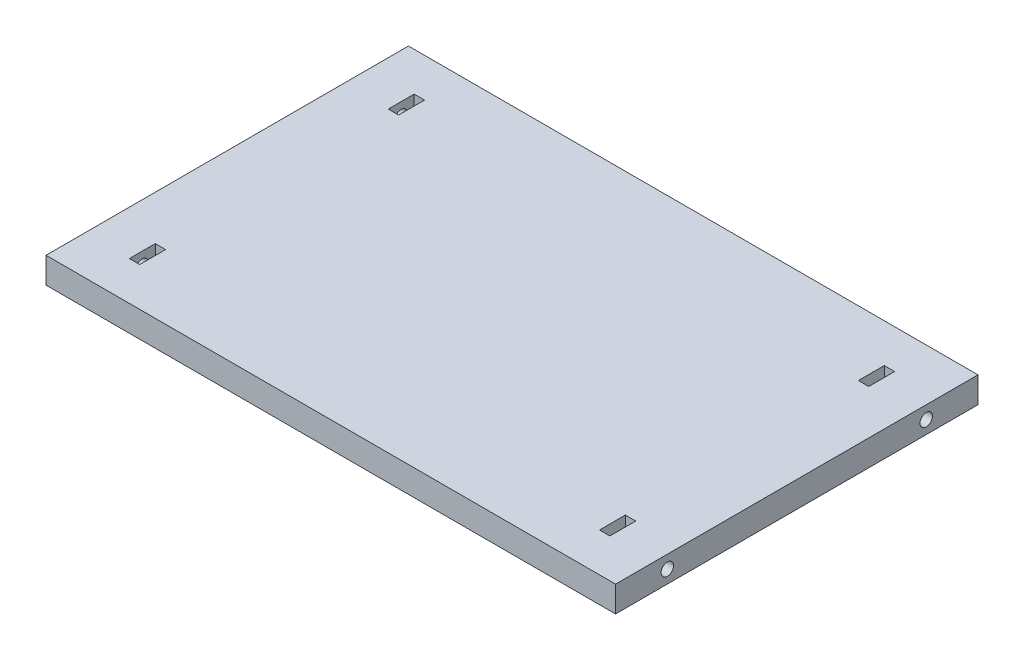
ISO-10303-21;
HEADER;
FILE_DESCRIPTION(('STEP AP214'),'2;1');
FILE_NAME('part.step','',(''),(''),'','','');
FILE_SCHEMA(('AUTOMOTIVE_DESIGN { 1 0 10303 214 1 1 1 1 }'));
ENDSEC;
DATA;
#1=APPLICATION_CONTEXT('core data for automotive mechanical design processes');
#2=APPLICATION_PROTOCOL_DEFINITION('international standard','automotive_design',2000,#1);
#3=PRODUCT_CONTEXT('',#1,'mechanical');
#4=PRODUCT('Part','Part','',(#3));
#5=PRODUCT_RELATED_PRODUCT_CATEGORY('part','',(#4));
#6=PRODUCT_DEFINITION_FORMATION('','',#4);
#7=PRODUCT_DEFINITION_CONTEXT('part definition',#1,'design');
#8=PRODUCT_DEFINITION('design','',#6,#7);
#9=PRODUCT_DEFINITION_SHAPE('','',#8);
#10=(LENGTH_UNIT() NAMED_UNIT(*) SI_UNIT(.MILLI.,.METRE.));
#11=(NAMED_UNIT(*) PLANE_ANGLE_UNIT() SI_UNIT($,.RADIAN.));
#12=(NAMED_UNIT(*) SI_UNIT($,.STERADIAN.) SOLID_ANGLE_UNIT());
#13=UNCERTAINTY_MEASURE_WITH_UNIT(LENGTH_MEASURE(1.E-05),#10,'distance_accuracy_value','');
#14=(GEOMETRIC_REPRESENTATION_CONTEXT(3) GLOBAL_UNCERTAINTY_ASSIGNED_CONTEXT((#13)) GLOBAL_UNIT_ASSIGNED_CONTEXT((#10,
#11,#12)) REPRESENTATION_CONTEXT('',''));
#15=CARTESIAN_POINT('',(0.,0.,0.));
#16=DIRECTION('',(0.,0.,1.));
#17=DIRECTION('',(1.,0.,0.));
#18=AXIS2_PLACEMENT_3D('',#15,#16,#17);
#19=CARTESIAN_POINT('',(55.,18.5,180.113577727726));
#20=DIRECTION('',(0.,-1.,0.));
#21=DIRECTION('',(1.,0.,0.));
#22=AXIS2_PLACEMENT_3D('',#19,#20,#21);
#23=PLANE('',#22);
#24=DIRECTION('',(0.,0.,-1.));
#25=VECTOR('',#24,1.);
#26=CARTESIAN_POINT('',(44.3999999999998,18.5,12.5));
#27=LINE('',#26,#25);
#28=CARTESIAN_POINT('',(44.3999999999998,18.5,12.5));
#29=VERTEX_POINT('',#28);
#30=CARTESIAN_POINT('',(44.3999999999998,18.5,7.5));
#31=VERTEX_POINT('',#30);
#32=EDGE_CURVE('E62',#29,#31,#27,.T.);
#33=ORIENTED_EDGE('',*,*,#32,.T.);
#34=DIRECTION('',(1.,0.,0.));
#35=VECTOR('',#34,1.);
#36=CARTESIAN_POINT('',(44.3999999999998,18.5,7.5));
#37=LINE('',#36,#35);
#38=CARTESIAN_POINT('',(46.3999999999998,18.5,7.5));
#39=VERTEX_POINT('',#38);
#40=EDGE_CURVE('E222',#31,#39,#37,.T.);
#41=ORIENTED_EDGE('',*,*,#40,.T.);
#42=DIRECTION('',(0.,0.,1.));
#43=VECTOR('',#42,1.);
#44=CARTESIAN_POINT('',(46.3999999999998,18.5,12.5));
#45=LINE('',#44,#43);
#46=CARTESIAN_POINT('',(46.3999999999998,18.5,12.5));
#47=VERTEX_POINT('',#46);
#48=EDGE_CURVE('E233',#39,#47,#45,.T.);
#49=ORIENTED_EDGE('',*,*,#48,.T.);
#50=DIRECTION('',(-1.,0.,0.));
#51=VECTOR('',#50,1.);
#52=CARTESIAN_POINT('',(44.3999999999998,18.5,12.5));
#53=LINE('',#52,#51);
#54=EDGE_CURVE('E230',#47,#29,#53,.T.);
#55=ORIENTED_EDGE('',*,*,#54,.T.);
#56=EDGE_LOOP('',(#33,#41,#49,#55));
#57=FACE_BOUND('',#56,.T.);
#58=DIRECTION('',(-1.,0.,0.));
#59=VECTOR('',#58,1.);
#60=CARTESIAN_POINT('',(-44.3999999999998,18.5,57.5));
#61=LINE('',#60,#59);
#62=CARTESIAN_POINT('',(-44.3999999999998,18.5,57.5));
#63=VERTEX_POINT('',#62);
#64=CARTESIAN_POINT('',(-46.3999999999998,18.5,57.5));
#65=VERTEX_POINT('',#64);
#66=EDGE_CURVE('E267',#63,#65,#61,.T.);
#67=ORIENTED_EDGE('',*,*,#66,.F.);
#68=DIRECTION('',(0.,0.,-1.));
#69=VECTOR('',#68,1.);
#70=CARTESIAN_POINT('',(-44.3999999999998,18.5,62.5));
#71=LINE('',#70,#69);
#72=CARTESIAN_POINT('',(-44.3999999999998,18.5,62.5));
#73=VERTEX_POINT('',#72);
#74=EDGE_CURVE('E265',#73,#63,#71,.T.);
#75=ORIENTED_EDGE('',*,*,#74,.F.);
#76=DIRECTION('',(1.,0.,0.));
#77=VECTOR('',#76,1.);
#78=CARTESIAN_POINT('',(-44.3999999999998,18.5,62.5));
#79=LINE('',#78,#77);
#80=CARTESIAN_POINT('',(-46.3999999999998,18.5,62.5));
#81=VERTEX_POINT('',#80);
#82=EDGE_CURVE('E255',#81,#73,#79,.T.);
#83=ORIENTED_EDGE('',*,*,#82,.F.);
#84=DIRECTION('',(0.,0.,1.));
#85=VECTOR('',#84,1.);
#86=CARTESIAN_POINT('',(-46.3999999999998,18.5,62.5));
#87=LINE('',#86,#85);
#88=EDGE_CURVE('E271',#65,#81,#87,.T.);
#89=ORIENTED_EDGE('',*,*,#88,.F.);
#90=EDGE_LOOP('',(#67,#75,#83,#89));
#91=FACE_BOUND('',#90,.T.);
#92=DIRECTION('',(-1.,0.,0.));
#93=VECTOR('',#92,1.);
#94=CARTESIAN_POINT('',(-44.3999999999998,18.5,7.5));
#95=LINE('',#94,#93);
#96=CARTESIAN_POINT('',(-44.3999999999998,18.5,7.50000000000001));
#97=VERTEX_POINT('',#96);
#98=CARTESIAN_POINT('',(-46.3999999999998,18.5,7.5));
#99=VERTEX_POINT('',#98);
#100=EDGE_CURVE('E301',#97,#99,#95,.T.);
#101=ORIENTED_EDGE('',*,*,#100,.F.);
#102=DIRECTION('',(0.,0.,-1.));
#103=VECTOR('',#102,1.);
#104=CARTESIAN_POINT('',(-44.3999999999998,18.5,12.5));
#105=LINE('',#104,#103);
#106=CARTESIAN_POINT('',(-44.3999999999998,18.5,12.5));
#107=VERTEX_POINT('',#106);
#108=EDGE_CURVE('E268',#107,#97,#105,.T.);
#109=ORIENTED_EDGE('',*,*,#108,.F.);
#110=DIRECTION('',(1.,0.,0.));
#111=VECTOR('',#110,1.);
#112=CARTESIAN_POINT('',(-44.3999999999998,18.5,12.5));
#113=LINE('',#112,#111);
#114=CARTESIAN_POINT('',(-46.3999999999998,18.5,12.5));
#115=VERTEX_POINT('',#114);
#116=EDGE_CURVE('E294',#115,#107,#113,.T.);
#117=ORIENTED_EDGE('',*,*,#116,.F.);
#118=DIRECTION('',(0.,0.,1.));
#119=VECTOR('',#118,1.);
#120=CARTESIAN_POINT('',(-46.3999999999998,18.5,12.5));
#121=LINE('',#120,#119);
#122=EDGE_CURVE('E297',#99,#115,#121,.T.);
#123=ORIENTED_EDGE('',*,*,#122,.F.);
#124=EDGE_LOOP('',(#101,#109,#117,#123));
#125=FACE_BOUND('',#124,.T.);
#126=DIRECTION('',(0.,0.,-1.));
#127=VECTOR('',#126,1.);
#128=CARTESIAN_POINT('',(-55.0000000000003,18.5,180.113577727726));
#129=LINE('',#128,#127);
#130=CARTESIAN_POINT('',(-55.,18.5,70.));
#131=VERTEX_POINT('',#130);
#132=CARTESIAN_POINT('',(-55.0000000000003,18.5,0.));
#133=VERTEX_POINT('',#132);
#134=EDGE_CURVE('E338',#131,#133,#129,.T.);
#135=ORIENTED_EDGE('',*,*,#134,.F.);
#136=DIRECTION('',(1.,0.,0.));
#137=VECTOR('',#136,1.);
#138=CARTESIAN_POINT('',(55.,18.5,70.));
#139=LINE('',#138,#137);
#140=CARTESIAN_POINT('',(55.,18.5,70.));
#141=VERTEX_POINT('',#140);
#142=EDGE_CURVE('E46',#131,#141,#139,.T.);
#143=ORIENTED_EDGE('',*,*,#142,.T.);
#144=DIRECTION('',(0.,0.,-1.));
#145=VECTOR('',#144,1.);
#146=CARTESIAN_POINT('',(55.,18.5,180.113577727726));
#147=LINE('',#146,#145);
#148=CARTESIAN_POINT('',(55.,18.5,0.));
#149=VERTEX_POINT('',#148);
#150=EDGE_CURVE('E340',#141,#149,#147,.T.);
#151=ORIENTED_EDGE('',*,*,#150,.T.);
#152=DIRECTION('',(-1.,0.,0.));
#153=VECTOR('',#152,1.);
#154=CARTESIAN_POINT('',(55.,18.5,0.));
#155=LINE('',#154,#153);
#156=EDGE_CURVE('E325',#149,#133,#155,.T.);
#157=ORIENTED_EDGE('',*,*,#156,.T.);
#158=EDGE_LOOP('',(#135,#143,#151,#157));
#159=FACE_BOUND('',#158,.T.);
#160=DIRECTION('',(0.,0.,-1.));
#161=VECTOR('',#160,1.);
#162=CARTESIAN_POINT('',(44.3999999999998,18.5,62.5));
#163=LINE('',#162,#161);
#164=CARTESIAN_POINT('',(44.3999999999998,18.5,62.5));
#165=VERTEX_POINT('',#164);
#166=CARTESIAN_POINT('',(44.3999999999998,18.5,57.5));
#167=VERTEX_POINT('',#166);
#168=EDGE_CURVE('E54',#165,#167,#163,.T.);
#169=ORIENTED_EDGE('',*,*,#168,.T.);
#170=DIRECTION('',(1.,0.,0.));
#171=VECTOR('',#170,1.);
#172=CARTESIAN_POINT('',(44.3999999999998,18.5,57.5));
#173=LINE('',#172,#171);
#174=CARTESIAN_POINT('',(46.3999999999998,18.5,57.5));
#175=VERTEX_POINT('',#174);
#176=EDGE_CURVE('E198',#167,#175,#173,.T.);
#177=ORIENTED_EDGE('',*,*,#176,.T.);
#178=DIRECTION('',(0.,0.,1.));
#179=VECTOR('',#178,1.);
#180=CARTESIAN_POINT('',(46.3999999999998,18.5,62.5));
#181=LINE('',#180,#179);
#182=CARTESIAN_POINT('',(46.3999999999998,18.5,62.5));
#183=VERTEX_POINT('',#182);
#184=EDGE_CURVE('E201',#175,#183,#181,.T.);
#185=ORIENTED_EDGE('',*,*,#184,.T.);
#186=DIRECTION('',(-1.,0.,0.));
#187=VECTOR('',#186,1.);
#188=CARTESIAN_POINT('',(44.3999999999998,18.5,62.5));
#189=LINE('',#188,#187);
#190=EDGE_CURVE('E207',#183,#165,#189,.T.);
#191=ORIENTED_EDGE('',*,*,#190,.T.);
#192=EDGE_LOOP('',(#169,#177,#185,#191));
#193=FACE_BOUND('',#192,.T.);
#194=ADVANCED_FACE('F37',(#57,#91,#125,#159,#193),#23,.F.);
#195=CARTESIAN_POINT('',(55.0000000000002,15.9999999999999,60.));
#196=DIRECTION('',(1.,0.,0.));
#197=DIRECTION('',(0.,0.,-1.));
#198=AXIS2_PLACEMENT_3D('',#195,#196,#197);
#199=CYLINDRICAL_SURFACE('',#198,1.2);
#200=CARTESIAN_POINT('',(55.0000000000002,15.9999999999999,60.));
#201=DIRECTION('',(1.,0.,0.));
#202=DIRECTION('',(0.,0.,-1.));
#203=AXIS2_PLACEMENT_3D('',#200,#201,#202);
#204=CIRCLE('',#203,1.2);
#205=CARTESIAN_POINT('',(55.0000000000002,15.9999999999999,58.8));
#206=VERTEX_POINT('',#205);
#207=EDGE_CURVE('E247',#206,#206,#204,.T.);
#208=ORIENTED_EDGE('',*,*,#207,.T.);
#209=EDGE_LOOP('',(#208));
#210=FACE_BOUND('',#209,.T.);
#211=CARTESIAN_POINT('',(46.3999999999998,15.9999999999999,60.));
#212=DIRECTION('',(-1.,0.,0.));
#213=DIRECTION('',(0.,0.,1.));
#214=AXIS2_PLACEMENT_3D('',#211,#212,#213);
#215=CIRCLE('',#214,1.2);
#216=CARTESIAN_POINT('',(46.3999999999998,15.9999999999999,61.2));
#217=VERTEX_POINT('',#216);
#218=EDGE_CURVE('E41',#217,#217,#215,.F.);
#219=ORIENTED_EDGE('',*,*,#218,.F.);
#220=EDGE_LOOP('',(#219));
#221=FACE_BOUND('',#220,.T.);
#222=ADVANCED_FACE('F361',(#210,#221),#199,.F.);
#223=CARTESIAN_POINT('',(55.0000000000002,15.9999999999998,10.));
#224=DIRECTION('',(1.,0.,0.));
#225=DIRECTION('',(0.,0.,-1.));
#226=AXIS2_PLACEMENT_3D('',#223,#224,#225);
#227=CYLINDRICAL_SURFACE('',#226,1.2);
#228=CARTESIAN_POINT('',(55.0000000000002,15.9999999999998,10.));
#229=DIRECTION('',(1.,0.,0.));
#230=DIRECTION('',(0.,0.,-1.));
#231=AXIS2_PLACEMENT_3D('',#228,#229,#230);
#232=CIRCLE('',#231,1.2);
#233=CARTESIAN_POINT('',(55.0000000000002,15.9999999999998,8.8));
#234=VERTEX_POINT('',#233);
#235=EDGE_CURVE('E244',#234,#234,#232,.T.);
#236=ORIENTED_EDGE('',*,*,#235,.T.);
#237=EDGE_LOOP('',(#236));
#238=FACE_BOUND('',#237,.T.);
#239=CARTESIAN_POINT('',(46.3999999999998,15.9999999999998,10.));
#240=DIRECTION('',(-1.,0.,0.));
#241=DIRECTION('',(0.,0.,1.));
#242=AXIS2_PLACEMENT_3D('',#239,#240,#241);
#243=CIRCLE('',#242,1.2);
#244=CARTESIAN_POINT('',(46.3999999999998,15.9999999999998,11.2));
#245=VERTEX_POINT('',#244);
#246=EDGE_CURVE('E214',#245,#245,#243,.F.);
#247=ORIENTED_EDGE('',*,*,#246,.F.);
#248=EDGE_LOOP('',(#247));
#249=FACE_BOUND('',#248,.T.);
#250=ADVANCED_FACE('F363',(#238,#249),#227,.F.);
#251=CARTESIAN_POINT('',(0.,0.,0.));
#252=DIRECTION('',(0.,0.,-1.));
#253=DIRECTION('',(-1.,0.,0.));
#254=AXIS2_PLACEMENT_3D('',#251,#252,#253);
#255=PLANE('',#254);
#256=DIRECTION('',(0.,1.,0.));
#257=VECTOR('',#256,1.);
#258=CARTESIAN_POINT('',(55.,18.5,0.));
#259=LINE('',#258,#257);
#260=CARTESIAN_POINT('',(55.,13.5,0.));
#261=VERTEX_POINT('',#260);
#262=EDGE_CURVE('E322',#261,#149,#259,.T.);
#263=ORIENTED_EDGE('',*,*,#262,.F.);
#264=DIRECTION('',(1.,0.,0.));
#265=VECTOR('',#264,1.);
#266=CARTESIAN_POINT('',(55.,13.5,0.));
#267=LINE('',#266,#265);
#268=CARTESIAN_POINT('',(-55.0000000000003,13.5,0.));
#269=VERTEX_POINT('',#268);
#270=EDGE_CURVE('E331',#269,#261,#267,.T.);
#271=ORIENTED_EDGE('',*,*,#270,.F.);
#272=DIRECTION('',(0.,-1.,0.));
#273=VECTOR('',#272,1.);
#274=CARTESIAN_POINT('',(-55.0000000000003,18.5,0.));
#275=LINE('',#274,#273);
#276=EDGE_CURVE('E328',#133,#269,#275,.T.);
#277=ORIENTED_EDGE('',*,*,#276,.F.);
#278=ORIENTED_EDGE('',*,*,#156,.F.);
#279=EDGE_LOOP('',(#263,#271,#277,#278));
#280=FACE_BOUND('',#279,.T.);
#281=ADVANCED_FACE('F370',(#280),#255,.T.);
#282=CARTESIAN_POINT('',(55.,13.5,180.113577727726));
#283=DIRECTION('',(0.,1.,0.));
#284=DIRECTION('',(-1.,0.,0.));
#285=AXIS2_PLACEMENT_3D('',#282,#283,#284);
#286=PLANE('',#285);
#287=DIRECTION('',(0.,0.,-1.));
#288=VECTOR('',#287,1.);
#289=CARTESIAN_POINT('',(55.,13.5,180.113577727726));
#290=LINE('',#289,#288);
#291=CARTESIAN_POINT('',(55.,13.5,70.));
#292=VERTEX_POINT('',#291);
#293=EDGE_CURVE('E334',#292,#261,#290,.T.);
#294=ORIENTED_EDGE('',*,*,#293,.F.);
#295=DIRECTION('',(-1.,0.,0.));
#296=VECTOR('',#295,1.);
#297=CARTESIAN_POINT('',(55.,13.5,70.));
#298=LINE('',#297,#296);
#299=CARTESIAN_POINT('',(-55.0000000000003,13.5,70.));
#300=VERTEX_POINT('',#299);
#301=EDGE_CURVE('E342',#292,#300,#298,.T.);
#302=ORIENTED_EDGE('',*,*,#301,.T.);
#303=DIRECTION('',(0.,0.,-1.));
#304=VECTOR('',#303,1.);
#305=CARTESIAN_POINT('',(-55.0000000000003,13.5,180.113577727726));
#306=LINE('',#305,#304);
#307=EDGE_CURVE('E336',#300,#269,#306,.T.);
#308=ORIENTED_EDGE('',*,*,#307,.T.);
#309=ORIENTED_EDGE('',*,*,#270,.T.);
#310=EDGE_LOOP('',(#294,#302,#308,#309));
#311=FACE_BOUND('',#310,.T.);
#312=ADVANCED_FACE('F431',(#311),#286,.F.);
#313=CARTESIAN_POINT('',(-55.0000000000003,18.5,180.113577727726));
#314=DIRECTION('',(1.,0.,0.));
#315=DIRECTION('',(0.,1.,0.));
#316=AXIS2_PLACEMENT_3D('',#313,#314,#315);
#317=PLANE('',#316);
#318=CARTESIAN_POINT('',(-55.0000000000002,15.9999999999998,10.));
#319=DIRECTION('',(-1.,0.,0.));
#320=DIRECTION('',(0.,0.,1.));
#321=AXIS2_PLACEMENT_3D('',#318,#319,#320);
#322=CIRCLE('',#321,1.2);
#323=CARTESIAN_POINT('',(-55.0000000000002,15.9999999999998,11.2));
#324=VERTEX_POINT('',#323);
#325=EDGE_CURVE('E315',#324,#324,#322,.T.);
#326=ORIENTED_EDGE('',*,*,#325,.F.);
#327=EDGE_LOOP('',(#326));
#328=FACE_BOUND('',#327,.T.);
#329=CARTESIAN_POINT('',(-55.0000000000002,15.9999999999999,60.));
#330=DIRECTION('',(-1.,0.,0.));
#331=DIRECTION('',(0.,0.,1.));
#332=AXIS2_PLACEMENT_3D('',#329,#330,#331);
#333=CIRCLE('',#332,1.2);
#334=CARTESIAN_POINT('',(-55.0000000000002,15.9999999999999,61.2));
#335=VERTEX_POINT('',#334);
#336=EDGE_CURVE('E318',#335,#335,#333,.T.);
#337=ORIENTED_EDGE('',*,*,#336,.F.);
#338=EDGE_LOOP('',(#337));
#339=FACE_BOUND('',#338,.T.);
#340=ORIENTED_EDGE('',*,*,#307,.F.);
#341=DIRECTION('',(0.,1.,0.));
#342=VECTOR('',#341,1.);
#343=CARTESIAN_POINT('',(-55.0000000000003,18.5,70.));
#344=LINE('',#343,#342);
#345=EDGE_CURVE('E345',#300,#131,#344,.T.);
#346=ORIENTED_EDGE('',*,*,#345,.T.);
#347=ORIENTED_EDGE('',*,*,#134,.T.);
#348=ORIENTED_EDGE('',*,*,#276,.T.);
#349=EDGE_LOOP('',(#340,#346,#347,#348));
#350=FACE_BOUND('',#349,.T.);
#351=ADVANCED_FACE('F435',(#328,#339,#350),#317,.F.);
#352=CARTESIAN_POINT('',(55.,18.5,180.113577727726));
#353=DIRECTION('',(-1.,0.,0.));
#354=DIRECTION('',(0.,0.,1.));
#355=AXIS2_PLACEMENT_3D('',#352,#353,#354);
#356=PLANE('',#355);
#357=ORIENTED_EDGE('',*,*,#235,.F.);
#358=EDGE_LOOP('',(#357));
#359=FACE_BOUND('',#358,.T.);
#360=ORIENTED_EDGE('',*,*,#207,.F.);
#361=EDGE_LOOP('',(#360));
#362=FACE_BOUND('',#361,.T.);
#363=ORIENTED_EDGE('',*,*,#150,.F.);
#364=DIRECTION('',(0.,-1.,0.));
#365=VECTOR('',#364,1.);
#366=CARTESIAN_POINT('',(55.,18.5,70.));
#367=LINE('',#366,#365);
#368=EDGE_CURVE('E11',#141,#292,#367,.T.);
#369=ORIENTED_EDGE('',*,*,#368,.T.);
#370=ORIENTED_EDGE('',*,*,#293,.T.);
#371=ORIENTED_EDGE('',*,*,#262,.T.);
#372=EDGE_LOOP('',(#363,#369,#370,#371));
#373=FACE_BOUND('',#372,.T.);
#374=ADVANCED_FACE('F39',(#359,#362,#373),#356,.F.);
#375=CARTESIAN_POINT('',(0.,0.,70.));
#376=DIRECTION('',(0.,0.,-1.));
#377=DIRECTION('',(1.,0.,0.));
#378=AXIS2_PLACEMENT_3D('',#375,#376,#377);
#379=PLANE('',#378);
#380=ORIENTED_EDGE('',*,*,#368,.F.);
#381=ORIENTED_EDGE('',*,*,#142,.F.);
#382=ORIENTED_EDGE('',*,*,#345,.F.);
#383=ORIENTED_EDGE('',*,*,#301,.F.);
#384=EDGE_LOOP('',(#380,#381,#382,#383));
#385=FACE_BOUND('',#384,.T.);
#386=ADVANCED_FACE('F424',(#385),#379,.F.);
#387=CARTESIAN_POINT('',(-55.0000000000002,15.9999999999999,60.));
#388=DIRECTION('',(-1.,0.,0.));
#389=DIRECTION('',(0.,0.,1.));
#390=AXIS2_PLACEMENT_3D('',#387,#388,#389);
#391=CYLINDRICAL_SURFACE('',#390,1.2);
#392=CARTESIAN_POINT('',(-46.3999999999998,15.9999999999999,60.));
#393=DIRECTION('',(-1.,0.,0.));
#394=DIRECTION('',(0.,0.,1.));
#395=AXIS2_PLACEMENT_3D('',#392,#393,#394);
#396=CIRCLE('',#395,1.2);
#397=CARTESIAN_POINT('',(-46.3999999999998,15.9999999999999,61.2));
#398=VERTEX_POINT('',#397);
#399=EDGE_CURVE('E319',#398,#398,#396,.F.);
#400=ORIENTED_EDGE('',*,*,#399,.T.);
#401=EDGE_LOOP('',(#400));
#402=FACE_BOUND('',#401,.T.);
#403=ORIENTED_EDGE('',*,*,#336,.T.);
#404=EDGE_LOOP('',(#403));
#405=FACE_BOUND('',#404,.T.);
#406=ADVANCED_FACE('F420',(#402,#405),#391,.F.);
#407=CARTESIAN_POINT('',(-55.0000000000002,15.9999999999998,10.));
#408=DIRECTION('',(-1.,0.,0.));
#409=DIRECTION('',(0.,0.,1.));
#410=AXIS2_PLACEMENT_3D('',#407,#408,#409);
#411=CYLINDRICAL_SURFACE('',#410,1.2);
#412=CARTESIAN_POINT('',(-46.3999999999998,15.9999999999998,10.));
#413=DIRECTION('',(-1.,0.,0.));
#414=DIRECTION('',(0.,0.,1.));
#415=AXIS2_PLACEMENT_3D('',#412,#413,#414);
#416=CIRCLE('',#415,1.2);
#417=CARTESIAN_POINT('',(-46.3999999999998,15.9999999999998,11.2));
#418=VERTEX_POINT('',#417);
#419=EDGE_CURVE('E278',#418,#418,#416,.F.);
#420=ORIENTED_EDGE('',*,*,#419,.T.);
#421=EDGE_LOOP('',(#420));
#422=FACE_BOUND('',#421,.T.);
#423=ORIENTED_EDGE('',*,*,#325,.T.);
#424=EDGE_LOOP('',(#423));
#425=FACE_BOUND('',#424,.T.);
#426=ADVANCED_FACE('F410',(#422,#425),#411,.F.);
#427=CARTESIAN_POINT('',(-46.3999999999998,14.,12.5));
#428=DIRECTION('',(-1.,0.,0.));
#429=DIRECTION('',(0.,0.,1.));
#430=AXIS2_PLACEMENT_3D('',#427,#428,#429);
#431=PLANE('',#430);
#432=ORIENTED_EDGE('',*,*,#122,.T.);
#433=DIRECTION('',(0.,1.,0.));
#434=VECTOR('',#433,1.);
#435=CARTESIAN_POINT('',(-46.3999999999998,14.,12.5));
#436=LINE('',#435,#434);
#437=CARTESIAN_POINT('',(-46.3999999999998,14.,12.5));
#438=VERTEX_POINT('',#437);
#439=EDGE_CURVE('E291',#438,#115,#436,.T.);
#440=ORIENTED_EDGE('',*,*,#439,.F.);
#441=DIRECTION('',(0.,0.,1.));
#442=VECTOR('',#441,1.);
#443=CARTESIAN_POINT('',(-46.3999999999998,14.,12.5));
#444=LINE('',#443,#442);
#445=CARTESIAN_POINT('',(-46.3999999999998,14.,7.5));
#446=VERTEX_POINT('',#445);
#447=EDGE_CURVE('E307',#446,#438,#444,.T.);
#448=ORIENTED_EDGE('',*,*,#447,.F.);
#449=DIRECTION('',(0.,1.,0.));
#450=VECTOR('',#449,1.);
#451=CARTESIAN_POINT('',(-46.3999999999998,14.,7.5));
#452=LINE('',#451,#450);
#453=EDGE_CURVE('E289',#446,#99,#452,.T.);
#454=ORIENTED_EDGE('',*,*,#453,.T.);
#455=EDGE_LOOP('',(#432,#440,#448,#454));
#456=FACE_BOUND('',#455,.T.);
#457=ORIENTED_EDGE('',*,*,#419,.F.);
#458=EDGE_LOOP('',(#457));
#459=FACE_BOUND('',#458,.T.);
#460=ADVANCED_FACE('F402',(#456,#459),#431,.F.);
#461=CARTESIAN_POINT('',(-44.3999999999998,14.,12.5));
#462=DIRECTION('',(1.,0.,0.));
#463=DIRECTION('',(0.,0.,-1.));
#464=AXIS2_PLACEMENT_3D('',#461,#462,#463);
#465=PLANE('',#464);
#466=ORIENTED_EDGE('',*,*,#108,.T.);
#467=DIRECTION('',(0.,1.,0.));
#468=VECTOR('',#467,1.);
#469=CARTESIAN_POINT('',(-44.3999999999998,14.,7.5));
#470=LINE('',#469,#468);
#471=CARTESIAN_POINT('',(-44.3999999999998,14.,7.5));
#472=VERTEX_POINT('',#471);
#473=EDGE_CURVE('E285',#472,#97,#470,.T.);
#474=ORIENTED_EDGE('',*,*,#473,.F.);
#475=DIRECTION('',(0.,0.,-1.));
#476=VECTOR('',#475,1.);
#477=CARTESIAN_POINT('',(-44.3999999999998,14.,12.5));
#478=LINE('',#477,#476);
#479=CARTESIAN_POINT('',(-44.3999999999998,14.,12.5));
#480=VERTEX_POINT('',#479);
#481=EDGE_CURVE('E298',#480,#472,#478,.T.);
#482=ORIENTED_EDGE('',*,*,#481,.F.);
#483=DIRECTION('',(0.,1.,0.));
#484=VECTOR('',#483,1.);
#485=CARTESIAN_POINT('',(-44.3999999999998,14.,12.5));
#486=LINE('',#485,#484);
#487=EDGE_CURVE('E250',#480,#107,#486,.T.);
#488=ORIENTED_EDGE('',*,*,#487,.T.);
#489=EDGE_LOOP('',(#466,#474,#482,#488));
#490=FACE_BOUND('',#489,.T.);
#491=ADVANCED_FACE('F398',(#490),#465,.F.);
#492=CARTESIAN_POINT('',(-44.3999999999998,14.,12.5));
#493=DIRECTION('',(0.,0.,1.));
#494=DIRECTION('',(1.,0.,0.));
#495=AXIS2_PLACEMENT_3D('',#492,#493,#494);
#496=PLANE('',#495);
#497=ORIENTED_EDGE('',*,*,#116,.T.);
#498=ORIENTED_EDGE('',*,*,#487,.F.);
#499=DIRECTION('',(1.,0.,0.));
#500=VECTOR('',#499,1.);
#501=CARTESIAN_POINT('',(-44.3999999999998,14.,12.5));
#502=LINE('',#501,#500);
#503=EDGE_CURVE('E288',#438,#480,#502,.T.);
#504=ORIENTED_EDGE('',*,*,#503,.F.);
#505=ORIENTED_EDGE('',*,*,#439,.T.);
#506=EDGE_LOOP('',(#497,#498,#504,#505));
#507=FACE_BOUND('',#506,.T.);
#508=ADVANCED_FACE('F401',(#507),#496,.F.);
#509=CARTESIAN_POINT('',(-44.3999999999998,14.,7.5));
#510=DIRECTION('',(0.,0.,-1.));
#511=DIRECTION('',(-1.,0.,0.));
#512=AXIS2_PLACEMENT_3D('',#509,#510,#511);
#513=PLANE('',#512);
#514=ORIENTED_EDGE('',*,*,#100,.T.);
#515=ORIENTED_EDGE('',*,*,#453,.F.);
#516=DIRECTION('',(-1.,0.,0.));
#517=VECTOR('',#516,1.);
#518=CARTESIAN_POINT('',(-44.3999999999998,14.,7.5));
#519=LINE('',#518,#517);
#520=EDGE_CURVE('E310',#472,#446,#519,.T.);
#521=ORIENTED_EDGE('',*,*,#520,.F.);
#522=ORIENTED_EDGE('',*,*,#473,.T.);
#523=EDGE_LOOP('',(#514,#515,#521,#522));
#524=FACE_BOUND('',#523,.T.);
#525=ADVANCED_FACE('F404',(#524),#513,.F.);
#526=CARTESIAN_POINT('',(0.,14.,0.));
#527=DIRECTION('',(0.,1.,0.));
#528=DIRECTION('',(0.,0.,1.));
#529=AXIS2_PLACEMENT_3D('',#526,#527,#528);
#530=PLANE('',#529);
#531=ORIENTED_EDGE('',*,*,#481,.T.);
#532=ORIENTED_EDGE('',*,*,#520,.T.);
#533=ORIENTED_EDGE('',*,*,#447,.T.);
#534=ORIENTED_EDGE('',*,*,#503,.T.);
#535=EDGE_LOOP('',(#531,#532,#533,#534));
#536=FACE_BOUND('',#535,.T.);
#537=ADVANCED_FACE('F390',(#536),#530,.T.);
#538=CARTESIAN_POINT('',(-46.3999999999998,14.,62.5));
#539=DIRECTION('',(-1.,0.,0.));
#540=DIRECTION('',(0.,0.,1.));
#541=AXIS2_PLACEMENT_3D('',#538,#539,#540);
#542=PLANE('',#541);
#543=ORIENTED_EDGE('',*,*,#88,.T.);
#544=DIRECTION('',(0.,1.,0.));
#545=VECTOR('',#544,1.);
#546=CARTESIAN_POINT('',(-46.3999999999998,14.,62.5));
#547=LINE('',#546,#545);
#548=CARTESIAN_POINT('',(-46.3999999999998,14.,62.5));
#549=VERTEX_POINT('',#548);
#550=EDGE_CURVE('E279',#549,#81,#547,.T.);
#551=ORIENTED_EDGE('',*,*,#550,.F.);
#552=DIRECTION('',(0.,0.,1.));
#553=VECTOR('',#552,1.);
#554=CARTESIAN_POINT('',(-46.3999999999998,14.,62.5));
#555=LINE('',#554,#553);
#556=CARTESIAN_POINT('',(-46.3999999999998,14.,57.5));
#557=VERTEX_POINT('',#556);
#558=EDGE_CURVE('E258',#557,#549,#555,.T.);
#559=ORIENTED_EDGE('',*,*,#558,.F.);
#560=DIRECTION('',(0.,1.,0.));
#561=VECTOR('',#560,1.);
#562=CARTESIAN_POINT('',(-46.3999999999998,14.,57.5));
#563=LINE('',#562,#561);
#564=EDGE_CURVE('E281',#557,#65,#563,.T.);
#565=ORIENTED_EDGE('',*,*,#564,.T.);
#566=EDGE_LOOP('',(#543,#551,#559,#565));
#567=FACE_BOUND('',#566,.T.);
#568=ORIENTED_EDGE('',*,*,#399,.F.);
#569=EDGE_LOOP('',(#568));
#570=FACE_BOUND('',#569,.T.);
#571=ADVANCED_FACE('F387',(#567,#570),#542,.F.);
#572=CARTESIAN_POINT('',(-44.3999999999998,14.,62.5));
#573=DIRECTION('',(1.,0.,0.));
#574=DIRECTION('',(0.,0.,-1.));
#575=AXIS2_PLACEMENT_3D('',#572,#573,#574);
#576=PLANE('',#575);
#577=ORIENTED_EDGE('',*,*,#74,.T.);
#578=DIRECTION('',(0.,1.,0.));
#579=VECTOR('',#578,1.);
#580=CARTESIAN_POINT('',(-44.3999999999998,14.,57.5));
#581=LINE('',#580,#579);
#582=CARTESIAN_POINT('',(-44.3999999999998,14.,57.5));
#583=VERTEX_POINT('',#582);
#584=EDGE_CURVE('E264',#583,#63,#581,.T.);
#585=ORIENTED_EDGE('',*,*,#584,.F.);
#586=DIRECTION('',(0.,0.,-1.));
#587=VECTOR('',#586,1.);
#588=CARTESIAN_POINT('',(-44.3999999999998,14.,62.5));
#589=LINE('',#588,#587);
#590=CARTESIAN_POINT('',(-44.3999999999998,14.,62.5));
#591=VERTEX_POINT('',#590);
#592=EDGE_CURVE('E251',#591,#583,#589,.T.);
#593=ORIENTED_EDGE('',*,*,#592,.F.);
#594=DIRECTION('',(0.,1.,0.));
#595=VECTOR('',#594,1.);
#596=CARTESIAN_POINT('',(-44.3999999999998,14.,62.5));
#597=LINE('',#596,#595);
#598=EDGE_CURVE('E276',#591,#73,#597,.T.);
#599=ORIENTED_EDGE('',*,*,#598,.T.);
#600=EDGE_LOOP('',(#577,#585,#593,#599));
#601=FACE_BOUND('',#600,.T.);
#602=ADVANCED_FACE('F385',(#601),#576,.F.);
#603=CARTESIAN_POINT('',(-44.3999999999998,14.,62.5));
#604=DIRECTION('',(0.,0.,1.));
#605=DIRECTION('',(1.,0.,0.));
#606=AXIS2_PLACEMENT_3D('',#603,#604,#605);
#607=PLANE('',#606);
#608=ORIENTED_EDGE('',*,*,#82,.T.);
#609=ORIENTED_EDGE('',*,*,#598,.F.);
#610=DIRECTION('',(1.,0.,0.));
#611=VECTOR('',#610,1.);
#612=CARTESIAN_POINT('',(-44.3999999999998,14.,62.5));
#613=LINE('',#612,#611);
#614=EDGE_CURVE('E261',#549,#591,#613,.T.);
#615=ORIENTED_EDGE('',*,*,#614,.F.);
#616=ORIENTED_EDGE('',*,*,#550,.T.);
#617=EDGE_LOOP('',(#608,#609,#615,#616));
#618=FACE_BOUND('',#617,.T.);
#619=ADVANCED_FACE('F382',(#618),#607,.F.);
#620=CARTESIAN_POINT('',(-44.3999999999998,14.,57.5));
#621=DIRECTION('',(0.,0.,-1.));
#622=DIRECTION('',(-1.,0.,0.));
#623=AXIS2_PLACEMENT_3D('',#620,#621,#622);
#624=PLANE('',#623);
#625=ORIENTED_EDGE('',*,*,#66,.T.);
#626=ORIENTED_EDGE('',*,*,#564,.F.);
#627=DIRECTION('',(-1.,0.,0.));
#628=VECTOR('',#627,1.);
#629=CARTESIAN_POINT('',(-44.3999999999998,14.,57.5));
#630=LINE('',#629,#628);
#631=EDGE_CURVE('E254',#583,#557,#630,.T.);
#632=ORIENTED_EDGE('',*,*,#631,.F.);
#633=ORIENTED_EDGE('',*,*,#584,.T.);
#634=EDGE_LOOP('',(#625,#626,#632,#633));
#635=FACE_BOUND('',#634,.T.);
#636=ADVANCED_FACE('F380',(#635),#624,.F.);
#637=CARTESIAN_POINT('',(0.,14.,0.));
#638=DIRECTION('',(0.,1.,0.));
#639=DIRECTION('',(0.,0.,1.));
#640=AXIS2_PLACEMENT_3D('',#637,#638,#639);
#641=PLANE('',#640);
#642=ORIENTED_EDGE('',*,*,#592,.T.);
#643=ORIENTED_EDGE('',*,*,#631,.T.);
#644=ORIENTED_EDGE('',*,*,#558,.T.);
#645=ORIENTED_EDGE('',*,*,#614,.T.);
#646=EDGE_LOOP('',(#642,#643,#644,#645));
#647=FACE_BOUND('',#646,.T.);
#648=ADVANCED_FACE('F376',(#647),#641,.T.);
#649=CARTESIAN_POINT('',(46.3999999999998,14.,12.5));
#650=DIRECTION('',(-1.,0.,0.));
#651=DIRECTION('',(0.,0.,1.));
#652=AXIS2_PLACEMENT_3D('',#649,#650,#651);
#653=PLANE('',#652);
#654=ORIENTED_EDGE('',*,*,#48,.F.);
#655=DIRECTION('',(0.,1.,0.));
#656=VECTOR('',#655,1.);
#657=CARTESIAN_POINT('',(46.3999999999998,14.,7.5));
#658=LINE('',#657,#656);
#659=CARTESIAN_POINT('',(46.3999999999998,14.,7.5));
#660=VERTEX_POINT('',#659);
#661=EDGE_CURVE('E239',#660,#39,#658,.T.);
#662=ORIENTED_EDGE('',*,*,#661,.F.);
#663=DIRECTION('',(0.,0.,1.));
#664=VECTOR('',#663,1.);
#665=CARTESIAN_POINT('',(46.3999999999998,14.,12.5));
#666=LINE('',#665,#664);
#667=CARTESIAN_POINT('',(46.3999999999998,14.,12.5));
#668=VERTEX_POINT('',#667);
#669=EDGE_CURVE('E224',#660,#668,#666,.T.);
#670=ORIENTED_EDGE('',*,*,#669,.T.);
#671=DIRECTION('',(0.,1.,0.));
#672=VECTOR('',#671,1.);
#673=CARTESIAN_POINT('',(46.3999999999998,14.,12.5));
#674=LINE('',#673,#672);
#675=EDGE_CURVE('E241',#668,#47,#674,.T.);
#676=ORIENTED_EDGE('',*,*,#675,.T.);
#677=EDGE_LOOP('',(#654,#662,#670,#676));
#678=FACE_BOUND('',#677,.T.);
#679=ORIENTED_EDGE('',*,*,#246,.T.);
#680=EDGE_LOOP('',(#679));
#681=FACE_BOUND('',#680,.T.);
#682=ADVANCED_FACE('F379',(#678,#681),#653,.T.);
#683=CARTESIAN_POINT('',(44.3999999999998,14.,12.5));
#684=DIRECTION('',(1.,0.,0.));
#685=DIRECTION('',(0.,0.,-1.));
#686=AXIS2_PLACEMENT_3D('',#683,#684,#685);
#687=PLANE('',#686);
#688=ORIENTED_EDGE('',*,*,#32,.F.);
#689=DIRECTION('',(0.,1.,0.));
#690=VECTOR('',#689,1.);
#691=CARTESIAN_POINT('',(44.3999999999998,14.,12.5));
#692=LINE('',#691,#690);
#693=CARTESIAN_POINT('',(44.3999999999998,14.,12.5));
#694=VERTEX_POINT('',#693);
#695=EDGE_CURVE('E228',#694,#29,#692,.T.);
#696=ORIENTED_EDGE('',*,*,#695,.F.);
#697=DIRECTION('',(0.,0.,-1.));
#698=VECTOR('',#697,1.);
#699=CARTESIAN_POINT('',(44.3999999999998,14.,12.5));
#700=LINE('',#699,#698);
#701=CARTESIAN_POINT('',(44.3999999999998,14.,7.5));
#702=VERTEX_POINT('',#701);
#703=EDGE_CURVE('E218',#694,#702,#700,.T.);
#704=ORIENTED_EDGE('',*,*,#703,.T.);
#705=DIRECTION('',(0.,1.,0.));
#706=VECTOR('',#705,1.);
#707=CARTESIAN_POINT('',(44.3999999999998,14.,7.5));
#708=LINE('',#707,#706);
#709=EDGE_CURVE('E208',#702,#31,#708,.T.);
#710=ORIENTED_EDGE('',*,*,#709,.T.);
#711=EDGE_LOOP('',(#688,#696,#704,#710));
#712=FACE_BOUND('',#711,.T.);
#713=ADVANCED_FACE('F483',(#712),#687,.T.);
#714=CARTESIAN_POINT('',(44.3999999999998,14.,7.5));
#715=DIRECTION('',(0.,0.,1.));
#716=DIRECTION('',(1.,0.,0.));
#717=AXIS2_PLACEMENT_3D('',#714,#715,#716);
#718=PLANE('',#717);
#719=ORIENTED_EDGE('',*,*,#40,.F.);
#720=ORIENTED_EDGE('',*,*,#709,.F.);
#721=DIRECTION('',(1.,0.,0.));
#722=VECTOR('',#721,1.);
#723=CARTESIAN_POINT('',(44.3999999999998,14.,7.5));
#724=LINE('',#723,#722);
#725=EDGE_CURVE('E226',#702,#660,#724,.T.);
#726=ORIENTED_EDGE('',*,*,#725,.T.);
#727=ORIENTED_EDGE('',*,*,#661,.T.);
#728=EDGE_LOOP('',(#719,#720,#726,#727));
#729=FACE_BOUND('',#728,.T.);
#730=ADVANCED_FACE('F480',(#729),#718,.T.);
#731=CARTESIAN_POINT('',(44.3999999999998,14.,12.5));
#732=DIRECTION('',(0.,0.,-1.));
#733=DIRECTION('',(-1.,0.,0.));
#734=AXIS2_PLACEMENT_3D('',#731,#732,#733);
#735=PLANE('',#734);
#736=ORIENTED_EDGE('',*,*,#54,.F.);
#737=ORIENTED_EDGE('',*,*,#675,.F.);
#738=DIRECTION('',(-1.,0.,0.));
#739=VECTOR('',#738,1.);
#740=CARTESIAN_POINT('',(44.3999999999998,14.,12.5));
#741=LINE('',#740,#739);
#742=EDGE_CURVE('E221',#668,#694,#741,.T.);
#743=ORIENTED_EDGE('',*,*,#742,.T.);
#744=ORIENTED_EDGE('',*,*,#695,.T.);
#745=EDGE_LOOP('',(#736,#737,#743,#744));
#746=FACE_BOUND('',#745,.T.);
#747=ADVANCED_FACE('F478',(#746),#735,.T.);
#748=CARTESIAN_POINT('',(0.,14.,0.));
#749=DIRECTION('',(0.,1.,0.));
#750=DIRECTION('',(0.,0.,1.));
#751=AXIS2_PLACEMENT_3D('',#748,#749,#750);
#752=PLANE('',#751);
#753=ORIENTED_EDGE('',*,*,#703,.F.);
#754=ORIENTED_EDGE('',*,*,#742,.F.);
#755=ORIENTED_EDGE('',*,*,#669,.F.);
#756=ORIENTED_EDGE('',*,*,#725,.F.);
#757=EDGE_LOOP('',(#753,#754,#755,#756));
#758=FACE_BOUND('',#757,.T.);
#759=ADVANCED_FACE('F474',(#758),#752,.T.);
#760=CARTESIAN_POINT('',(46.3999999999998,14.,62.5));
#761=DIRECTION('',(-1.,0.,0.));
#762=DIRECTION('',(0.,0.,1.));
#763=AXIS2_PLACEMENT_3D('',#760,#761,#762);
#764=PLANE('',#763);
#765=ORIENTED_EDGE('',*,*,#184,.F.);
#766=DIRECTION('',(0.,1.,0.));
#767=VECTOR('',#766,1.);
#768=CARTESIAN_POINT('',(46.3999999999998,14.,57.5));
#769=LINE('',#768,#767);
#770=CARTESIAN_POINT('',(46.3999999999998,14.,57.5));
#771=VERTEX_POINT('',#770);
#772=EDGE_CURVE('E215',#771,#175,#769,.T.);
#773=ORIENTED_EDGE('',*,*,#772,.F.);
#774=DIRECTION('',(0.,0.,1.));
#775=VECTOR('',#774,1.);
#776=CARTESIAN_POINT('',(46.3999999999998,14.,62.5));
#777=LINE('',#776,#775);
#778=CARTESIAN_POINT('',(46.3999999999998,14.,62.5));
#779=VERTEX_POINT('',#778);
#780=EDGE_CURVE('E189',#771,#779,#777,.T.);
#781=ORIENTED_EDGE('',*,*,#780,.T.);
#782=DIRECTION('',(0.,1.,0.));
#783=VECTOR('',#782,1.);
#784=CARTESIAN_POINT('',(46.3999999999998,14.,62.5));
#785=LINE('',#784,#783);
#786=EDGE_CURVE('E185',#779,#183,#785,.T.);
#787=ORIENTED_EDGE('',*,*,#786,.T.);
#788=EDGE_LOOP('',(#765,#773,#781,#787));
#789=FACE_BOUND('',#788,.T.);
#790=ORIENTED_EDGE('',*,*,#218,.T.);
#791=EDGE_LOOP('',(#790));
#792=FACE_BOUND('',#791,.T.);
#793=ADVANCED_FACE('F359',(#789,#792),#764,.T.);
#794=CARTESIAN_POINT('',(44.3999999999998,14.,62.5));
#795=DIRECTION('',(1.,0.,0.));
#796=DIRECTION('',(0.,0.,-1.));
#797=AXIS2_PLACEMENT_3D('',#794,#795,#796);
#798=PLANE('',#797);
#799=ORIENTED_EDGE('',*,*,#168,.F.);
#800=DIRECTION('',(0.,1.,0.));
#801=VECTOR('',#800,1.);
#802=CARTESIAN_POINT('',(44.3999999999998,14.,62.5));
#803=LINE('',#802,#801);
#804=CARTESIAN_POINT('',(44.3999999999998,14.,62.5));
#805=VERTEX_POINT('',#804);
#806=EDGE_CURVE('E183',#805,#165,#803,.T.);
#807=ORIENTED_EDGE('',*,*,#806,.F.);
#808=DIRECTION('',(0.,0.,-1.));
#809=VECTOR('',#808,1.);
#810=CARTESIAN_POINT('',(44.3999999999998,14.,62.5));
#811=LINE('',#810,#809);
#812=CARTESIAN_POINT('',(44.3999999999998,14.,57.5));
#813=VERTEX_POINT('',#812);
#814=EDGE_CURVE('E190',#805,#813,#811,.T.);
#815=ORIENTED_EDGE('',*,*,#814,.T.);
#816=DIRECTION('',(0.,1.,0.));
#817=VECTOR('',#816,1.);
#818=CARTESIAN_POINT('',(44.3999999999998,14.,57.5));
#819=LINE('',#818,#817);
#820=EDGE_CURVE('E212',#813,#167,#819,.T.);
#821=ORIENTED_EDGE('',*,*,#820,.T.);
#822=EDGE_LOOP('',(#799,#807,#815,#821));
#823=FACE_BOUND('',#822,.T.);
#824=ADVANCED_FACE('F193',(#823),#798,.T.);
#825=CARTESIAN_POINT('',(44.3999999999998,14.,57.5));
#826=DIRECTION('',(0.,0.,1.));
#827=DIRECTION('',(1.,0.,0.));
#828=AXIS2_PLACEMENT_3D('',#825,#826,#827);
#829=PLANE('',#828);
#830=ORIENTED_EDGE('',*,*,#176,.F.);
#831=ORIENTED_EDGE('',*,*,#820,.F.);
#832=DIRECTION('',(1.,0.,0.));
#833=VECTOR('',#832,1.);
#834=CARTESIAN_POINT('',(44.3999999999998,14.,57.5));
#835=LINE('',#834,#833);
#836=EDGE_CURVE('E195',#813,#771,#835,.T.);
#837=ORIENTED_EDGE('',*,*,#836,.T.);
#838=ORIENTED_EDGE('',*,*,#772,.T.);
#839=EDGE_LOOP('',(#830,#831,#837,#838));
#840=FACE_BOUND('',#839,.T.);
#841=ADVANCED_FACE('F462',(#840),#829,.T.);
#842=CARTESIAN_POINT('',(44.3999999999998,14.,62.5));
#843=DIRECTION('',(0.,0.,-1.));
#844=DIRECTION('',(-1.,0.,0.));
#845=AXIS2_PLACEMENT_3D('',#842,#843,#844);
#846=PLANE('',#845);
#847=ORIENTED_EDGE('',*,*,#190,.F.);
#848=ORIENTED_EDGE('',*,*,#786,.F.);
#849=DIRECTION('',(-1.,0.,0.));
#850=VECTOR('',#849,1.);
#851=CARTESIAN_POINT('',(44.3999999999998,14.,62.5));
#852=LINE('',#851,#850);
#853=EDGE_CURVE('E180',#779,#805,#852,.T.);
#854=ORIENTED_EDGE('',*,*,#853,.T.);
#855=ORIENTED_EDGE('',*,*,#806,.T.);
#856=EDGE_LOOP('',(#847,#848,#854,#855));
#857=FACE_BOUND('',#856,.T.);
#858=ADVANCED_FACE('F182',(#857),#846,.T.);
#859=CARTESIAN_POINT('',(0.,14.,0.));
#860=DIRECTION('',(0.,1.,0.));
#861=DIRECTION('',(0.,0.,1.));
#862=AXIS2_PLACEMENT_3D('',#859,#860,#861);
#863=PLANE('',#862);
#864=ORIENTED_EDGE('',*,*,#814,.F.);
#865=ORIENTED_EDGE('',*,*,#853,.F.);
#866=ORIENTED_EDGE('',*,*,#780,.F.);
#867=ORIENTED_EDGE('',*,*,#836,.F.);
#868=EDGE_LOOP('',(#864,#865,#866,#867));
#869=FACE_BOUND('',#868,.T.);
#870=ADVANCED_FACE('F197',(#869),#863,.T.);
#871=CLOSED_SHELL('',(#194,#222,#250,#281,#312,#351,#374,#386,#406,#426,#460,#491,#508,#525,
#537,#571,#602,#619,#636,#648,#682,#713,#730,#747,#759,#793,#824,#841,#858,#870));
#872=MANIFOLD_SOLID_BREP('B2',#871);
#873=ADVANCED_BREP_SHAPE_REPRESENTATION('',(#18,#872),#14);
#874=SHAPE_DEFINITION_REPRESENTATION(#9,#873);
ENDSEC;
END-ISO-10303-21;
